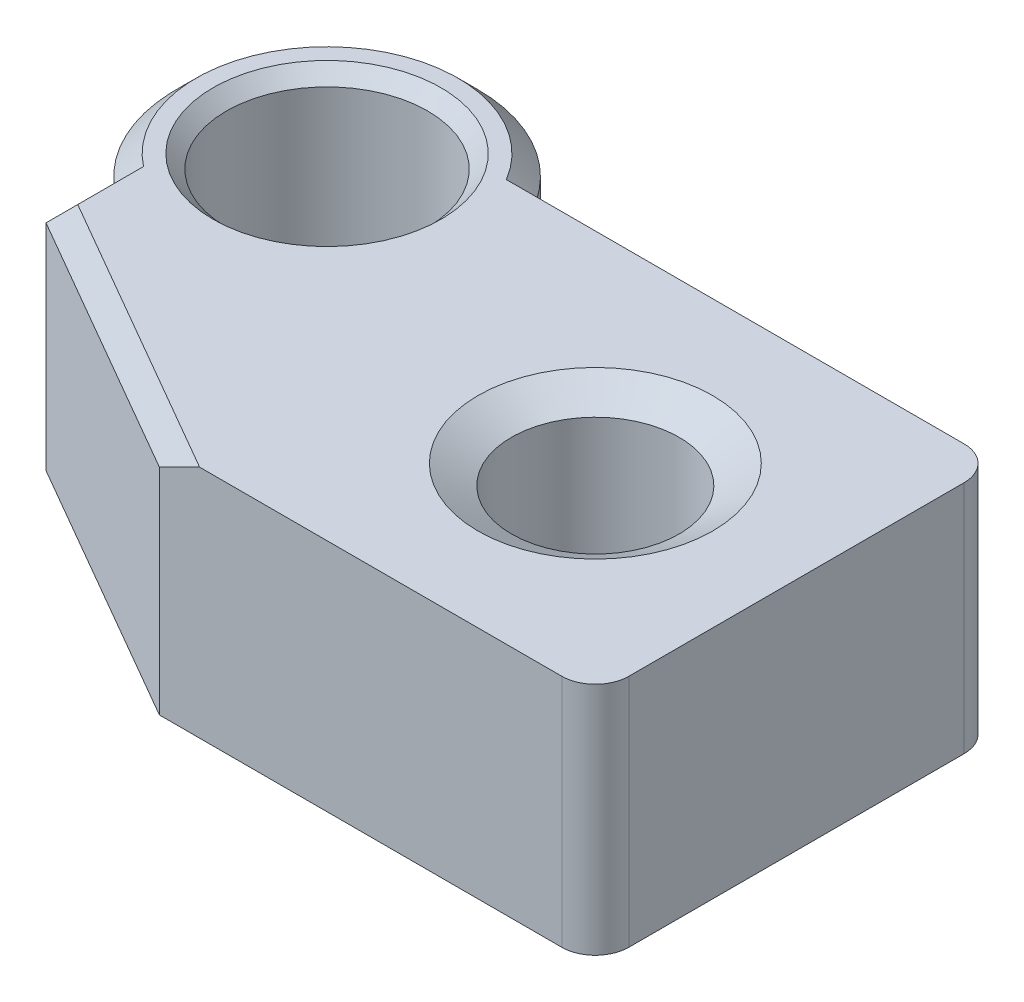
ISO-10303-21;
HEADER;
FILE_DESCRIPTION(('STEP AP214'),'2;1');
FILE_NAME('part.step','',(''),(''),'','','');
FILE_SCHEMA(('AUTOMOTIVE_DESIGN { 1 0 10303 214 1 1 1 1 }'));
ENDSEC;
DATA;
#1=APPLICATION_CONTEXT('core data for automotive mechanical design processes');
#2=APPLICATION_PROTOCOL_DEFINITION('international standard','automotive_design',2000,#1);
#3=PRODUCT_CONTEXT('',#1,'mechanical');
#4=PRODUCT('Part','Part','',(#3));
#5=PRODUCT_RELATED_PRODUCT_CATEGORY('part','',(#4));
#6=PRODUCT_DEFINITION_FORMATION('','',#4);
#7=PRODUCT_DEFINITION_CONTEXT('part definition',#1,'design');
#8=PRODUCT_DEFINITION('design','',#6,#7);
#9=PRODUCT_DEFINITION_SHAPE('','',#8);
#10=(LENGTH_UNIT() NAMED_UNIT(*) SI_UNIT(.MILLI.,.METRE.));
#11=(NAMED_UNIT(*) PLANE_ANGLE_UNIT() SI_UNIT($,.RADIAN.));
#12=(NAMED_UNIT(*) SI_UNIT($,.STERADIAN.) SOLID_ANGLE_UNIT());
#13=UNCERTAINTY_MEASURE_WITH_UNIT(LENGTH_MEASURE(1.E-05),#10,'distance_accuracy_value','');
#14=(GEOMETRIC_REPRESENTATION_CONTEXT(3) GLOBAL_UNCERTAINTY_ASSIGNED_CONTEXT((#13)) GLOBAL_UNIT_ASSIGNED_CONTEXT((#10,
#11,#12)) REPRESENTATION_CONTEXT('',''));
#15=CARTESIAN_POINT('',(0.,0.,0.));
#16=DIRECTION('',(0.,0.,1.));
#17=DIRECTION('',(1.,0.,0.));
#18=AXIS2_PLACEMENT_3D('',#15,#16,#17);
#19=CARTESIAN_POINT('',(-4.84435562925362,35.,-20.));
#20=DIRECTION('',(0.,0.,-1.));
#21=DIRECTION('',(-1.,0.,0.));
#22=AXIS2_PLACEMENT_3D('',#19,#20,#21);
#23=PLANE('',#22);
#24=DIRECTION('',(1.,0.,0.));
#25=VECTOR('',#24,1.);
#26=CARTESIAN_POINT('',(-4.84435562925362,0.,-20.));
#27=LINE('',#26,#25);
#28=CARTESIAN_POINT('',(-1.95113885676778,0.,-20.));
#29=VERTEX_POINT('',#28);
#30=CARTESIAN_POINT('',(60.,0.,-20.));
#31=VERTEX_POINT('',#30);
#32=EDGE_CURVE('E143',#29,#31,#27,.T.);
#33=ORIENTED_EDGE('',*,*,#32,.F.);
#34=DIRECTION('',(0.,-1.,0.));
#35=VECTOR('',#34,1.);
#36=CARTESIAN_POINT('',(-1.95113885676778,35.,-20.));
#37=LINE('',#36,#35);
#38=CARTESIAN_POINT('',(-1.95113885676778,29.3753109471978,-20.));
#39=VERTEX_POINT('',#38);
#40=EDGE_CURVE('E260',#29,#39,#37,.F.);
#41=ORIENTED_EDGE('',*,*,#40,.T.);
#42=CARTESIAN_POINT('',(-1.95113885676778,29.3753109471978,-20.));
#43=CARTESIAN_POINT('',(-2.43093552728547,29.8154283799261,-20.));
#44=CARTESIAN_POINT('',(-2.91178230032534,30.254405867048,-20.));
#45=CARTESIAN_POINT('',(-3.87602791843594,31.1294902840864,-20.));
#46=CARTESIAN_POINT('',(-4.35942661068586,31.5655973824585,-20.));
#47=CARTESIAN_POINT('',(-5.40863460486666,32.5054848331286,-20.));
#48=CARTESIAN_POINT('',(-5.97498570303803,33.0086617315781,-20.));
#49=CARTESIAN_POINT('',(-6.82841762979105,33.7590241480721,-20.));
#50=CARTESIAN_POINT('',(-7.11355581621878,34.0084197399272,-20.));
#51=CARTESIAN_POINT('',(-7.68530027764479,34.5055267070164,-20.));
#52=CARTESIAN_POINT('',(-7.9719065645859,34.7532380685113,-20.));
#53=CARTESIAN_POINT('',(-8.25933095721673,35.,-20.));
#54=B_SPLINE_CURVE_WITH_KNOTS('',3,(#42,#43,#44,#45,#46,#47,#48,#49,#50,#51,#52,#53),
.UNSPECIFIED.,.F.,.F.,(4,2,2,2,2,4),(0.,1.95324936939647,3.90638306677739,6.1791121462796,
7.31555583929257,8.45200879187084),.UNSPECIFIED.);
#55=CARTESIAN_POINT('',(-8.25933095721676,35.,-20.));
#56=VERTEX_POINT('',#55);
#57=EDGE_CURVE('E170',#39,#56,#54,.T.);
#58=ORIENTED_EDGE('',*,*,#57,.T.);
#59=DIRECTION('',(1.,0.,0.));
#60=VECTOR('',#59,1.);
#61=CARTESIAN_POINT('',(-4.84435562925362,35.,-20.));
#62=LINE('',#61,#60);
#63=CARTESIAN_POINT('',(60.,35.,-20.));
#64=VERTEX_POINT('',#63);
#65=EDGE_CURVE('E150',#56,#64,#62,.T.);
#66=ORIENTED_EDGE('',*,*,#65,.T.);
#67=DIRECTION('',(0.,-1.,0.));
#68=VECTOR('',#67,1.);
#69=CARTESIAN_POINT('',(60.,35.,-20.));
#70=LINE('',#69,#68);
#71=EDGE_CURVE('E263',#64,#31,#70,.T.);
#72=ORIENTED_EDGE('',*,*,#71,.T.);
#73=EDGE_LOOP('',(#33,#41,#58,#66,#72));
#74=FACE_BOUND('',#73,.T.);
#75=ADVANCED_FACE('F35',(#74),#23,.T.);
#76=CARTESIAN_POINT('',(-25.,35.,-10.));
#77=DIRECTION('',(0.,-1.,0.));
#78=DIRECTION('',(0.,0.,-1.));
#79=AXIS2_PLACEMENT_3D('',#76,#77,#78);
#80=CYLINDRICAL_SURFACE('',#79,22.5);
#81=CARTESIAN_POINT('',(-25.,32.,-10.));
#82=DIRECTION('',(0.,1.,0.));
#83=DIRECTION('',(0.,0.,1.));
#84=AXIS2_PLACEMENT_3D('',#81,#82,#83);
#85=CIRCLE('',#84,22.5);
#86=CARTESIAN_POINT('',(-40.,32.,6.77050983124841));
#87=VERTEX_POINT('',#86);
#88=CARTESIAN_POINT('',(-6.14184088281,32.,-22.2727272727273));
#89=VERTEX_POINT('',#88);
#90=EDGE_CURVE('E165',#87,#89,#85,.F.);
#91=ORIENTED_EDGE('',*,*,#90,.T.);
#92=DIRECTION('',(0.,-1.,0.));
#93=VECTOR('',#92,1.);
#94=CARTESIAN_POINT('',(-6.14184088280999,35.,-22.2727272727273));
#95=LINE('',#94,#93);
#96=CARTESIAN_POINT('',(-6.14184088281,0.,-22.2727272727273));
#97=VERTEX_POINT('',#96);
#98=EDGE_CURVE('E266',#89,#97,#95,.T.);
#99=ORIENTED_EDGE('',*,*,#98,.T.);
#100=CARTESIAN_POINT('',(-25.,0.,-10.));
#101=DIRECTION('',(0.,1.,0.));
#102=DIRECTION('',(0.,0.,1.));
#103=AXIS2_PLACEMENT_3D('',#100,#101,#102);
#104=CIRCLE('',#103,22.5);
#105=CARTESIAN_POINT('',(-40.,0.,6.77050983124841));
#106=VERTEX_POINT('',#105);
#107=EDGE_CURVE('E148',#97,#106,#104,.T.);
#108=ORIENTED_EDGE('',*,*,#107,.T.);
#109=DIRECTION('',(0.,-1.,0.));
#110=VECTOR('',#109,1.);
#111=CARTESIAN_POINT('',(-40.,35.,6.77050983124841));
#112=LINE('',#111,#110);
#113=EDGE_CURVE('E151',#87,#106,#112,.T.);
#114=ORIENTED_EDGE('',*,*,#113,.F.);
#115=EDGE_LOOP('',(#91,#99,#108,#114));
#116=FACE_BOUND('',#115,.T.);
#117=ADVANCED_FACE('F187',(#116),#80,.T.);
#118=CARTESIAN_POINT('',(-40.,35.,6.77050983124841));
#119=DIRECTION('',(1.,0.,0.));
#120=DIRECTION('',(0.,0.,-1.));
#121=AXIS2_PLACEMENT_3D('',#118,#119,#120);
#122=PLANE('',#121);
#123=DIRECTION('',(0.,-1.,0.));
#124=VECTOR('',#123,1.);
#125=CARTESIAN_POINT('',(-40.,35.,16.9059892324149));
#126=LINE('',#125,#124);
#127=CARTESIAN_POINT('',(-40.,32.,16.9059892324149));
#128=VERTEX_POINT('',#127);
#129=CARTESIAN_POINT('',(-40.,0.,16.9059892324149));
#130=VERTEX_POINT('',#129);
#131=EDGE_CURVE('E129',#128,#130,#126,.T.);
#132=ORIENTED_EDGE('',*,*,#131,.F.);
#133=DIRECTION('',(0.,0.,-1.));
#134=VECTOR('',#133,1.);
#135=CARTESIAN_POINT('',(-40.,32.,6.77050983124841));
#136=LINE('',#135,#134);
#137=EDGE_CURVE('E168',#128,#87,#136,.T.);
#138=ORIENTED_EDGE('',*,*,#137,.T.);
#139=ORIENTED_EDGE('',*,*,#113,.T.);
#140=DIRECTION('',(0.,0.,1.));
#141=VECTOR('',#140,1.);
#142=CARTESIAN_POINT('',(-40.,0.,6.77050983124841));
#143=LINE('',#142,#141);
#144=EDGE_CURVE('E138',#106,#130,#143,.T.);
#145=ORIENTED_EDGE('',*,*,#144,.T.);
#146=EDGE_LOOP('',(#132,#138,#139,#145));
#147=FACE_BOUND('',#146,.T.);
#148=ADVANCED_FACE('F311',(#147),#122,.F.);
#149=CARTESIAN_POINT('',(-40.,35.,16.9059892324149));
#150=DIRECTION('',(0.500000000000001,0.,-0.866025403784438));
#151=DIRECTION('',(-0.866025403784438,0.,-0.500000000000001));
#152=AXIS2_PLACEMENT_3D('',#149,#150,#151);
#153=PLANE('',#152);
#154=DIRECTION('',(0.,-1.,0.));
#155=VECTOR('',#154,1.);
#156=CARTESIAN_POINT('',(0.,35.,40.));
#157=LINE('',#156,#155);
#158=CARTESIAN_POINT('',(0.,32.,40.));
#159=VERTEX_POINT('',#158);
#160=CARTESIAN_POINT('',(0.,0.,40.));
#161=VERTEX_POINT('',#160);
#162=EDGE_CURVE('E122',#159,#161,#157,.T.);
#163=ORIENTED_EDGE('',*,*,#162,.F.);
#164=DIRECTION('',(-0.866025403784438,0.,-0.500000000000001));
#165=VECTOR('',#164,1.);
#166=CARTESIAN_POINT('',(-40.,32.,16.9059892324149));
#167=LINE('',#166,#165);
#168=EDGE_CURVE('E163',#159,#128,#167,.T.);
#169=ORIENTED_EDGE('',*,*,#168,.T.);
#170=ORIENTED_EDGE('',*,*,#131,.T.);
#171=DIRECTION('',(0.866025403784438,0.,0.500000000000001));
#172=VECTOR('',#171,1.);
#173=CARTESIAN_POINT('',(-40.,0.,16.9059892324149));
#174=LINE('',#173,#172);
#175=EDGE_CURVE('E133',#130,#161,#174,.T.);
#176=ORIENTED_EDGE('',*,*,#175,.T.);
#177=EDGE_LOOP('',(#163,#169,#170,#176));
#178=FACE_BOUND('',#177,.T.);
#179=ADVANCED_FACE('F134',(#178),#153,.F.);
#180=CARTESIAN_POINT('',(0.,35.,40.));
#181=DIRECTION('',(0.,0.,-1.));
#182=DIRECTION('',(-1.,0.,0.));
#183=AXIS2_PLACEMENT_3D('',#180,#181,#182);
#184=PLANE('',#183);
#185=DIRECTION('',(1.,0.,0.));
#186=VECTOR('',#185,1.);
#187=CARTESIAN_POINT('',(0.,0.,40.));
#188=LINE('',#187,#186);
#189=CARTESIAN_POINT('',(60.,0.,40.));
#190=VERTEX_POINT('',#189);
#191=EDGE_CURVE('E125',#161,#190,#188,.T.);
#192=ORIENTED_EDGE('',*,*,#191,.T.);
#193=DIRECTION('',(0.,-1.,0.));
#194=VECTOR('',#193,1.);
#195=CARTESIAN_POINT('',(60.,35.,40.));
#196=LINE('',#195,#194);
#197=CARTESIAN_POINT('',(60.,35.,40.));
#198=VERTEX_POINT('',#197);
#199=EDGE_CURVE('E55',#190,#198,#196,.F.);
#200=ORIENTED_EDGE('',*,*,#199,.T.);
#201=DIRECTION('',(1.,0.,0.));
#202=VECTOR('',#201,1.);
#203=CARTESIAN_POINT('',(0.,35.,40.));
#204=LINE('',#203,#202);
#205=CARTESIAN_POINT('',(5.99999999999992,35.,40.));
#206=VERTEX_POINT('',#205);
#207=EDGE_CURVE('E130',#206,#198,#204,.T.);
#208=ORIENTED_EDGE('',*,*,#207,.F.);
#209=DIRECTION('',(-0.894427190999913,-0.447213595499963,0.));
#210=VECTOR('',#209,1.);
#211=CARTESIAN_POINT('',(-29.9205080756886,17.0397459621555,40.));
#212=LINE('',#211,#210);
#213=EDGE_CURVE('E126',#206,#159,#212,.T.);
#214=ORIENTED_EDGE('',*,*,#213,.T.);
#215=ORIENTED_EDGE('',*,*,#162,.T.);
#216=EDGE_LOOP('',(#192,#200,#208,#214,#215));
#217=FACE_BOUND('',#216,.T.);
#218=ADVANCED_FACE('F124',(#217),#184,.F.);
#219=CARTESIAN_POINT('',(65.,35.,-20.));
#220=DIRECTION('',(1.,0.,0.));
#221=DIRECTION('',(0.,0.,-1.));
#222=AXIS2_PLACEMENT_3D('',#219,#220,#221);
#223=PLANE('',#222);
#224=DIRECTION('',(0.,0.,1.));
#225=VECTOR('',#224,1.);
#226=CARTESIAN_POINT('',(65.,35.,-20.));
#227=LINE('',#226,#225);
#228=CARTESIAN_POINT('',(65.,35.,-15.));
#229=VERTEX_POINT('',#228);
#230=CARTESIAN_POINT('',(65.,35.,35.));
#231=VERTEX_POINT('',#230);
#232=EDGE_CURVE('E324',#229,#231,#227,.T.);
#233=ORIENTED_EDGE('',*,*,#232,.T.);
#234=DIRECTION('',(0.,-1.,0.));
#235=VECTOR('',#234,1.);
#236=CARTESIAN_POINT('',(65.,0.,35.));
#237=LINE('',#236,#235);
#238=CARTESIAN_POINT('',(65.,0.,35.));
#239=VERTEX_POINT('',#238);
#240=EDGE_CURVE('E245',#231,#239,#237,.T.);
#241=ORIENTED_EDGE('',*,*,#240,.T.);
#242=DIRECTION('',(0.,0.,1.));
#243=VECTOR('',#242,1.);
#244=CARTESIAN_POINT('',(65.,0.,-20.));
#245=LINE('',#244,#243);
#246=CARTESIAN_POINT('',(65.,0.,-15.));
#247=VERTEX_POINT('',#246);
#248=EDGE_CURVE('E141',#247,#239,#245,.T.);
#249=ORIENTED_EDGE('',*,*,#248,.F.);
#250=DIRECTION('',(0.,-1.,0.));
#251=VECTOR('',#250,1.);
#252=CARTESIAN_POINT('',(65.,35.,-15.));
#253=LINE('',#252,#251);
#254=EDGE_CURVE('E258',#247,#229,#253,.F.);
#255=ORIENTED_EDGE('',*,*,#254,.T.);
#256=EDGE_LOOP('',(#233,#241,#249,#255));
#257=FACE_BOUND('',#256,.T.);
#258=ADVANCED_FACE('F189',(#257),#223,.T.);
#259=CARTESIAN_POINT('',(-25.,35.,-10.));
#260=DIRECTION('',(0.,1.,0.));
#261=DIRECTION('',(0.,0.,1.));
#262=AXIS2_PLACEMENT_3D('',#259,#260,#261);
#263=PLANE('',#262);
#264=CARTESIAN_POINT('',(35.,35.,10.));
#265=DIRECTION('',(0.,1.,0.));
#266=DIRECTION('',(0.,0.,1.));
#267=AXIS2_PLACEMENT_3D('',#264,#265,#266);
#268=CIRCLE('',#267,17.5000000000001);
#269=CARTESIAN_POINT('',(35.,35.,27.5000000000001));
#270=VERTEX_POINT('',#269);
#271=EDGE_CURVE('E269',#270,#270,#268,.F.);
#272=ORIENTED_EDGE('',*,*,#271,.T.);
#273=EDGE_LOOP('',(#272));
#274=FACE_BOUND('',#273,.T.);
#275=CARTESIAN_POINT('',(-25.,35.,-10.));
#276=DIRECTION('',(0.,1.,0.));
#277=DIRECTION('',(0.,0.,1.));
#278=AXIS2_PLACEMENT_3D('',#275,#276,#277);
#279=CIRCLE('',#278,17.0000000000001);
#280=CARTESIAN_POINT('',(-25.,35.,7.00000000000013));
#281=VERTEX_POINT('',#280);
#282=EDGE_CURVE('E281',#281,#281,#279,.F.);
#283=ORIENTED_EDGE('',*,*,#282,.T.);
#284=EDGE_LOOP('',(#283));
#285=FACE_BOUND('',#284,.T.);
#286=ORIENTED_EDGE('',*,*,#207,.T.);
#287=CARTESIAN_POINT('',(60.,35.,35.));
#288=DIRECTION('',(0.,1.,0.));
#289=DIRECTION('',(0.,0.,1.));
#290=AXIS2_PLACEMENT_3D('',#287,#288,#289);
#291=CIRCLE('',#290,5.);
#292=EDGE_CURVE('E243',#198,#231,#291,.T.);
#293=ORIENTED_EDGE('',*,*,#292,.T.);
#294=ORIENTED_EDGE('',*,*,#232,.F.);
#295=CARTESIAN_POINT('',(60.,35.,-15.));
#296=DIRECTION('',(0.,1.,0.));
#297=DIRECTION('',(0.,0.,1.));
#298=AXIS2_PLACEMENT_3D('',#295,#296,#297);
#299=CIRCLE('',#298,5.);
#300=EDGE_CURVE('E249',#229,#64,#299,.T.);
#301=ORIENTED_EDGE('',*,*,#300,.T.);
#302=ORIENTED_EDGE('',*,*,#65,.F.);
#303=CARTESIAN_POINT('',(-25.,35.,-10.));
#304=DIRECTION('',(0.,1.,0.));
#305=DIRECTION('',(0.,0.,1.));
#306=AXIS2_PLACEMENT_3D('',#303,#304,#305);
#307=CIRCLE('',#306,19.5);
#308=CARTESIAN_POINT('',(-37.,35.,5.3704261489394));
#309=VERTEX_POINT('',#308);
#310=EDGE_CURVE('E157',#56,#309,#307,.T.);
#311=ORIENTED_EDGE('',*,*,#310,.T.);
#312=DIRECTION('',(0.,0.,1.));
#313=VECTOR('',#312,1.);
#314=CARTESIAN_POINT('',(-37.,35.,16.9059892324149));
#315=LINE('',#314,#313);
#316=CARTESIAN_POINT('',(-37.,35.,15.1739384248461));
#317=VERTEX_POINT('',#316);
#318=EDGE_CURVE('E154',#309,#317,#315,.T.);
#319=ORIENTED_EDGE('',*,*,#318,.T.);
#320=DIRECTION('',(0.866025403784438,0.,0.500000000000001));
#321=VECTOR('',#320,1.);
#322=CARTESIAN_POINT('',(1.49999999999998,35.,37.4019237886467));
#323=LINE('',#322,#321);
#324=EDGE_CURVE('E159',#317,#206,#323,.T.);
#325=ORIENTED_EDGE('',*,*,#324,.T.);
#326=EDGE_LOOP('',(#286,#293,#294,#301,#302,#311,#319,#325));
#327=FACE_BOUND('',#326,.T.);
#328=ADVANCED_FACE('F296',(#274,#285,#327),#263,.T.);
#329=CARTESIAN_POINT('',(-25.,0.,-10.));
#330=DIRECTION('',(0.,1.,0.));
#331=DIRECTION('',(0.,0.,1.));
#332=AXIS2_PLACEMENT_3D('',#329,#330,#331);
#333=PLANE('',#332);
#334=CARTESIAN_POINT('',(35.,0.,10.));
#335=DIRECTION('',(0.,1.,0.));
#336=DIRECTION('',(0.,0.,1.));
#337=AXIS2_PLACEMENT_3D('',#334,#335,#336);
#338=CIRCLE('',#337,15.3867513459481);
#339=CARTESIAN_POINT('',(35.,0.,25.386751345948));
#340=VERTEX_POINT('',#339);
#341=EDGE_CURVE('E278',#340,#340,#338,.T.);
#342=ORIENTED_EDGE('',*,*,#341,.T.);
#343=EDGE_LOOP('',(#342));
#344=FACE_BOUND('',#343,.T.);
#345=CARTESIAN_POINT('',(-25.,0.,-10.));
#346=DIRECTION('',(0.,1.,0.));
#347=DIRECTION('',(0.,0.,1.));
#348=AXIS2_PLACEMENT_3D('',#345,#346,#347);
#349=CIRCLE('',#348,17.);
#350=CARTESIAN_POINT('',(-25.,0.,6.99999999999998));
#351=VERTEX_POINT('',#350);
#352=EDGE_CURVE('E177',#351,#351,#349,.T.);
#353=ORIENTED_EDGE('',*,*,#352,.T.);
#354=EDGE_LOOP('',(#353));
#355=FACE_BOUND('',#354,.T.);
#356=ORIENTED_EDGE('',*,*,#248,.T.);
#357=CARTESIAN_POINT('',(60.,0.,35.));
#358=DIRECTION('',(0.,1.,0.));
#359=DIRECTION('',(0.,0.,1.));
#360=AXIS2_PLACEMENT_3D('',#357,#358,#359);
#361=CIRCLE('',#360,5.);
#362=EDGE_CURVE('E63',#239,#190,#361,.F.);
#363=ORIENTED_EDGE('',*,*,#362,.T.);
#364=ORIENTED_EDGE('',*,*,#191,.F.);
#365=ORIENTED_EDGE('',*,*,#175,.F.);
#366=ORIENTED_EDGE('',*,*,#144,.F.);
#367=ORIENTED_EDGE('',*,*,#107,.F.);
#368=CARTESIAN_POINT('',(-1.95113885676778,0.,-25.));
#369=DIRECTION('',(0.,1.,0.));
#370=DIRECTION('',(0.,0.,1.));
#371=AXIS2_PLACEMENT_3D('',#368,#369,#370);
#372=CIRCLE('',#371,5.);
#373=EDGE_CURVE('E48',#97,#29,#372,.T.);
#374=ORIENTED_EDGE('',*,*,#373,.T.);
#375=ORIENTED_EDGE('',*,*,#32,.T.);
#376=CARTESIAN_POINT('',(60.,0.,-15.));
#377=DIRECTION('',(0.,1.,0.));
#378=DIRECTION('',(0.,0.,1.));
#379=AXIS2_PLACEMENT_3D('',#376,#377,#378);
#380=CIRCLE('',#379,5.);
#381=EDGE_CURVE('E255',#31,#247,#380,.F.);
#382=ORIENTED_EDGE('',*,*,#381,.T.);
#383=EDGE_LOOP('',(#356,#363,#364,#365,#366,#367,#374,#375,#382));
#384=FACE_BOUND('',#383,.T.);
#385=ADVANCED_FACE('F140',(#344,#355,#384),#333,.F.);
#386=CARTESIAN_POINT('',(-25.,-1.2E-05,-10.));
#387=DIRECTION('',(0.,1.,0.));
#388=DIRECTION('',(0.,0.,1.));
#389=AXIS2_PLACEMENT_3D('',#386,#387,#388);
#390=CYLINDRICAL_SURFACE('',#389,15.);
#391=CARTESIAN_POINT('',(-25.,1.99999999999999,-10.));
#392=DIRECTION('',(0.,1.,0.));
#393=DIRECTION('',(0.,0.,1.));
#394=AXIS2_PLACEMENT_3D('',#391,#392,#393);
#395=CIRCLE('',#394,15.);
#396=CARTESIAN_POINT('',(-25.,1.99999999999999,5.));
#397=VERTEX_POINT('',#396);
#398=EDGE_CURVE('E284',#397,#397,#395,.F.);
#399=CARTESIAN_POINT('',(-25.,32.9999999999999,-10.));
#400=DIRECTION('',(0.,1.,0.));
#401=DIRECTION('',(0.,0.,1.));
#402=AXIS2_PLACEMENT_3D('',#399,#400,#401);
#403=CIRCLE('',#402,15.);
#404=CARTESIAN_POINT('',(-25.,32.9999999999999,5.));
#405=VERTEX_POINT('',#404);
#406=EDGE_CURVE('E286',#405,#405,#403,.T.);
#407=CARTESIAN_POINT('',(-25.,1.99999999999999,5.));
#408=CARTESIAN_POINT('',(-25.,2.32291666666665,5.));
#409=CARTESIAN_POINT('',(-25.,2.64583333333332,5.));
#410=CARTESIAN_POINT('',(-25.,3.29166666666665,5.));
#411=CARTESIAN_POINT('',(-25.,3.61458333333332,5.));
#412=CARTESIAN_POINT('',(-25.,4.26041666666665,5.));
#413=CARTESIAN_POINT('',(-25.,4.58333333333331,5.));
#414=CARTESIAN_POINT('',(-25.,5.22916666666664,5.));
#415=CARTESIAN_POINT('',(-25.,5.55208333333331,5.));
#416=CARTESIAN_POINT('',(-25.,6.19791666666664,5.));
#417=CARTESIAN_POINT('',(-25.,6.52083333333331,5.));
#418=CARTESIAN_POINT('',(-25.,7.16666666666664,5.));
#419=CARTESIAN_POINT('',(-25.,7.4895833333333,5.));
#420=CARTESIAN_POINT('',(-25.,8.13541666666663,5.));
#421=CARTESIAN_POINT('',(-25.,8.4583333333333,5.));
#422=CARTESIAN_POINT('',(-25.,9.10416666666663,5.));
#423=CARTESIAN_POINT('',(-25.,9.42708333333329,5.));
#424=CARTESIAN_POINT('',(-25.,10.0729166666666,5.));
#425=CARTESIAN_POINT('',(-25.,10.3958333333333,5.));
#426=CARTESIAN_POINT('',(-25.,11.0416666666666,5.));
#427=CARTESIAN_POINT('',(-25.,11.3645833333333,5.));
#428=CARTESIAN_POINT('',(-25.,12.0104166666666,5.));
#429=CARTESIAN_POINT('',(-25.,12.3333333333333,5.));
#430=CARTESIAN_POINT('',(-25.,12.9791666666666,5.));
#431=CARTESIAN_POINT('',(-25.,13.3020833333333,5.));
#432=CARTESIAN_POINT('',(-25.,13.9479166666666,5.));
#433=CARTESIAN_POINT('',(-25.,14.2708333333333,5.));
#434=CARTESIAN_POINT('',(-25.,14.9166666666666,5.));
#435=CARTESIAN_POINT('',(-25.,15.2395833333333,5.));
#436=CARTESIAN_POINT('',(-25.,15.8854166666666,5.));
#437=CARTESIAN_POINT('',(-25.,16.2083333333333,5.));
#438=CARTESIAN_POINT('',(-25.,16.8541666666666,5.));
#439=CARTESIAN_POINT('',(-25.,17.1770833333333,5.));
#440=CARTESIAN_POINT('',(-25.,17.8229166666666,5.));
#441=CARTESIAN_POINT('',(-25.,18.1458333333333,5.));
#442=CARTESIAN_POINT('',(-25.,18.7916666666666,5.));
#443=CARTESIAN_POINT('',(-25.,19.1145833333333,5.));
#444=CARTESIAN_POINT('',(-25.,19.7604166666666,5.));
#445=CARTESIAN_POINT('',(-25.,20.0833333333333,5.));
#446=CARTESIAN_POINT('',(-25.,20.7291666666666,5.));
#447=CARTESIAN_POINT('',(-25.,21.0520833333333,5.));
#448=CARTESIAN_POINT('',(-25.,21.6979166666666,5.));
#449=CARTESIAN_POINT('',(-25.,22.0208333333333,5.));
#450=CARTESIAN_POINT('',(-25.,22.6666666666666,5.));
#451=CARTESIAN_POINT('',(-25.,22.9895833333332,5.));
#452=CARTESIAN_POINT('',(-25.,23.6354166666666,5.));
#453=CARTESIAN_POINT('',(-25.,23.9583333333332,5.));
#454=CARTESIAN_POINT('',(-25.,24.6041666666666,5.));
#455=CARTESIAN_POINT('',(-25.,24.9270833333332,5.));
#456=CARTESIAN_POINT('',(-25.,25.5729166666666,5.));
#457=CARTESIAN_POINT('',(-25.,25.8958333333332,5.));
#458=CARTESIAN_POINT('',(-25.,26.5416666666666,5.));
#459=CARTESIAN_POINT('',(-25.,26.8645833333332,5.));
#460=CARTESIAN_POINT('',(-25.,27.5104166666666,5.));
#461=CARTESIAN_POINT('',(-25.,27.8333333333332,5.));
#462=CARTESIAN_POINT('',(-25.,28.4791666666666,5.));
#463=CARTESIAN_POINT('',(-25.,28.8020833333332,5.));
#464=CARTESIAN_POINT('',(-25.,29.4479166666666,5.));
#465=CARTESIAN_POINT('',(-25.,29.7708333333332,5.));
#466=CARTESIAN_POINT('',(-25.,30.4166666666666,5.));
#467=CARTESIAN_POINT('',(-25.,30.7395833333332,5.));
#468=CARTESIAN_POINT('',(-25.,31.3854166666665,5.));
#469=CARTESIAN_POINT('',(-25.,31.7083333333332,5.));
#470=CARTESIAN_POINT('',(-25.,32.3541666666665,5.));
#471=CARTESIAN_POINT('',(-25.,32.6770833333332,5.));
#472=CARTESIAN_POINT('',(-25.,32.9999999999999,5.));
#473=B_SPLINE_CURVE_WITH_KNOTS('',3,(#407,#408,#409,#410,#411,#412,#413,#414,#415,#416,#417,
#418,#419,#420,#421,#422,#423,#424,#425,#426,#427,#428,#429,#430,#431,#432,#433,#434,#435,#436,
#437,#438,#439,#440,#441,#442,#443,#444,#445,#446,#447,#448,#449,#450,#451,#452,#453,#454,#455,
#456,#457,#458,#459,#460,#461,#462,#463,#464,#465,#466,#467,#468,#469,#470,#471,#472),
.UNSPECIFIED.,.F.,.F.,(4,2,2,2,2,2,2,2,2,2,2,2,2,2,2,2,2,2,2,2,2,2,2,2,2,2,2,2,2,2,2,2,4),(0.,
0.968749999999997,1.93749999999999,2.90624999999999,3.87499999999999,4.84374999999998,
5.81249999999998,6.78124999999998,7.74999999999997,8.71874999999997,9.68749999999996,10.65625,
11.625,12.59375,13.5625,14.5312499999999,15.4999999999999,16.4687499999999,17.4374999999999,
18.4062499999999,19.3749999999999,20.3437499999999,21.3124999999999,22.2812499999999,
23.2499999999999,24.2187499999999,25.1874999999999,26.1562499999999,27.1249999999999,
28.0937499999999,29.0624999999999,30.0312499999999,30.9999999999999),.UNSPECIFIED.);
#474=EDGE_CURVE('BSEAM295',#397,#405,#473,.T.);
#475=ORIENTED_EDGE('',*,*,#398,.T.);
#476=ORIENTED_EDGE('',*,*,#406,.T.);
#477=ORIENTED_EDGE('',*,*,#474,.T.);
#478=ORIENTED_EDGE('',*,*,#474,.F.);
#479=EDGE_LOOP('',(#475,#477,#476,#478));
#480=FACE_BOUND('',#479,.T.);
#481=ADVANCED_FACE('F295',(#480),#390,.F.);
#482=CARTESIAN_POINT('',(35.,-1.2E-05,10.));
#483=DIRECTION('',(0.,1.,0.));
#484=DIRECTION('',(0.,0.,1.));
#485=AXIS2_PLACEMENT_3D('',#482,#483,#484);
#486=CYLINDRICAL_SURFACE('',#485,12.5);
#487=CARTESIAN_POINT('',(35.,4.99999999999989,10.));
#488=DIRECTION('',(0.,1.,0.));
#489=DIRECTION('',(0.,0.,1.));
#490=AXIS2_PLACEMENT_3D('',#487,#488,#489);
#491=CIRCLE('',#490,12.5);
#492=CARTESIAN_POINT('',(35.,4.99999999999989,22.5));
#493=VERTEX_POINT('',#492);
#494=EDGE_CURVE('E272',#493,#493,#491,.F.);
#495=CARTESIAN_POINT('',(35.,32.1132486540518,10.));
#496=DIRECTION('',(0.,1.,0.));
#497=DIRECTION('',(0.,0.,1.));
#498=AXIS2_PLACEMENT_3D('',#495,#496,#497);
#499=CIRCLE('',#498,12.5);
#500=CARTESIAN_POINT('',(35.,32.1132486540518,22.5));
#501=VERTEX_POINT('',#500);
#502=EDGE_CURVE('E275',#501,#501,#499,.T.);
#503=CARTESIAN_POINT('',(35.,4.99999999999989,22.5));
#504=CARTESIAN_POINT('',(35.,5.28242967347959,22.5));
#505=CARTESIAN_POINT('',(35.,5.5648593469593,22.5));
#506=CARTESIAN_POINT('',(35.,6.12971869391872,22.5));
#507=CARTESIAN_POINT('',(35.,6.41214836739843,22.5));
#508=CARTESIAN_POINT('',(35.,6.97700771435784,22.5));
#509=CARTESIAN_POINT('',(35.,7.25943738783755,22.5));
#510=CARTESIAN_POINT('',(35.,7.82429673479696,22.5));
#511=CARTESIAN_POINT('',(35.,8.10672640827667,22.5));
#512=CARTESIAN_POINT('',(35.,8.67158575523609,22.5));
#513=CARTESIAN_POINT('',(35.,8.95401542871579,22.5));
#514=CARTESIAN_POINT('',(35.,9.51887477567521,22.5));
#515=CARTESIAN_POINT('',(35.,9.80130444915492,22.5));
#516=CARTESIAN_POINT('',(35.,10.3661637961143,22.5));
#517=CARTESIAN_POINT('',(35.,10.648593469594,22.5));
#518=CARTESIAN_POINT('',(35.,11.2134528165535,22.5));
#519=CARTESIAN_POINT('',(35.,11.4958824900332,22.5));
#520=CARTESIAN_POINT('',(35.,12.0607418369926,22.5));
#521=CARTESIAN_POINT('',(35.,12.3431715104723,22.5));
#522=CARTESIAN_POINT('',(35.,12.9080308574317,22.5));
#523=CARTESIAN_POINT('',(35.,13.1904605309114,22.5));
#524=CARTESIAN_POINT('',(35.,13.7553198778708,22.5));
#525=CARTESIAN_POINT('',(35.,14.0377495513505,22.5));
#526=CARTESIAN_POINT('',(35.,14.6026088983099,22.5));
#527=CARTESIAN_POINT('',(35.,14.8850385717897,22.5));
#528=CARTESIAN_POINT('',(35.,15.4498979187491,22.5));
#529=CARTESIAN_POINT('',(35.,15.7323275922288,22.5));
#530=CARTESIAN_POINT('',(35.,16.2971869391882,22.5));
#531=CARTESIAN_POINT('',(35.,16.5796166126679,22.5));
#532=CARTESIAN_POINT('',(35.,17.1444759596273,22.5));
#533=CARTESIAN_POINT('',(35.,17.426905633107,22.5));
#534=CARTESIAN_POINT('',(35.,17.9917649800664,22.5));
#535=CARTESIAN_POINT('',(35.,18.2741946535461,22.5));
#536=CARTESIAN_POINT('',(35.,18.8390540005056,22.5));
#537=CARTESIAN_POINT('',(35.,19.1214836739853,22.5));
#538=CARTESIAN_POINT('',(35.,19.6863430209447,22.5));
#539=CARTESIAN_POINT('',(35.,19.9687726944244,22.5));
#540=CARTESIAN_POINT('',(35.,20.5336320413838,22.5));
#541=CARTESIAN_POINT('',(35.,20.8160617148635,22.5));
#542=CARTESIAN_POINT('',(35.,21.3809210618229,22.5));
#543=CARTESIAN_POINT('',(35.,21.6633507353026,22.5));
#544=CARTESIAN_POINT('',(35.,22.2282100822621,22.5));
#545=CARTESIAN_POINT('',(35.,22.5106397557418,22.5));
#546=CARTESIAN_POINT('',(35.,23.0754991027012,22.5));
#547=CARTESIAN_POINT('',(35.,23.3579287761809,22.5));
#548=CARTESIAN_POINT('',(35.,23.9227881231403,22.5));
#549=CARTESIAN_POINT('',(35.,24.20521779662,22.5));
#550=CARTESIAN_POINT('',(35.,24.7700771435794,22.5));
#551=CARTESIAN_POINT('',(35.,25.0525068170591,22.5));
#552=CARTESIAN_POINT('',(35.,25.6173661640185,22.5));
#553=CARTESIAN_POINT('',(35.,25.8997958374983,22.5));
#554=CARTESIAN_POINT('',(35.,26.4646551844577,22.5));
#555=CARTESIAN_POINT('',(35.,26.7470848579374,22.5));
#556=CARTESIAN_POINT('',(35.,27.3119442048968,22.5));
#557=CARTESIAN_POINT('',(35.,27.5943738783765,22.5));
#558=CARTESIAN_POINT('',(35.,28.1592332253359,22.5));
#559=CARTESIAN_POINT('',(35.,28.4416628988156,22.5));
#560=CARTESIAN_POINT('',(35.,29.006522245775,22.5));
#561=CARTESIAN_POINT('',(35.,29.2889519192547,22.5));
#562=CARTESIAN_POINT('',(35.,29.8538112662142,22.5));
#563=CARTESIAN_POINT('',(35.,30.1362409396939,22.5));
#564=CARTESIAN_POINT('',(35.,30.7011002866533,22.5));
#565=CARTESIAN_POINT('',(35.,30.983529960133,22.5));
#566=CARTESIAN_POINT('',(35.,31.5483893070924,22.5));
#567=CARTESIAN_POINT('',(35.,31.8308189805721,22.5));
#568=CARTESIAN_POINT('',(35.,32.1132486540518,22.5));
#569=B_SPLINE_CURVE_WITH_KNOTS('',3,(#503,#504,#505,#506,#507,#508,#509,#510,#511,#512,#513,
#514,#515,#516,#517,#518,#519,#520,#521,#522,#523,#524,#525,#526,#527,#528,#529,#530,#531,#532,
#533,#534,#535,#536,#537,#538,#539,#540,#541,#542,#543,#544,#545,#546,#547,#548,#549,#550,#551,
#552,#553,#554,#555,#556,#557,#558,#559,#560,#561,#562,#563,#564,#565,#566,#567,#568),
.UNSPECIFIED.,.F.,.F.,(4,2,2,2,2,2,2,2,2,2,2,2,2,2,2,2,2,2,2,2,2,2,2,2,2,2,2,2,2,2,2,2,4),(0.,
0.847289020439124,1.69457804087825,2.54186706131737,3.38915608175649,4.23644510219562,
5.08373412263474,5.93102314307386,6.77831216351298,7.62560118395211,8.47289020439123,
9.32017922483035,10.1674682452695,11.0147572657086,11.8620462861477,12.7093353065868,
13.556624327026,14.4039133474651,15.2512023679042,16.0984913883433,16.9457804087825,
17.7930694292216,18.6403584496607,19.4876474700998,20.334936490539,21.1822255109781,
22.0295145314172,22.8768035518563,23.7240925722954,24.5713815927346,25.4186706131737,
26.2659596336128,27.1132486540519),.UNSPECIFIED.);
#570=EDGE_CURVE('BSEAM303',#493,#501,#569,.T.);
#571=ORIENTED_EDGE('',*,*,#494,.T.);
#572=ORIENTED_EDGE('',*,*,#502,.T.);
#573=ORIENTED_EDGE('',*,*,#570,.T.);
#574=ORIENTED_EDGE('',*,*,#570,.F.);
#575=EDGE_LOOP('',(#571,#573,#572,#574));
#576=FACE_BOUND('',#575,.T.);
#577=ADVANCED_FACE('F303',(#576),#486,.F.);
#578=CARTESIAN_POINT('',(-25.,35.,-10.));
#579=DIRECTION('',(0.,-1.,0.));
#580=DIRECTION('',(0.,0.,-1.));
#581=AXIS2_PLACEMENT_3D('',#578,#579,#580);
#582=CONICAL_SURFACE('',#581,19.5,0.785398163397444);
#583=ORIENTED_EDGE('',*,*,#57,.F.);
#584=CARTESIAN_POINT('',(-1.95113885676778,29.3753109471978,-20.));
#585=CARTESIAN_POINT('',(-2.02856914047657,29.4463417982122,-20.0000026458152));
#586=CARTESIAN_POINT('',(-2.10637714007067,29.5169508832972,-20.0017985148575));
#587=CARTESIAN_POINT('',(-2.26271661312481,29.6571944238616,-20.0091032882244));
#588=CARTESIAN_POINT('',(-2.34124820680167,29.7268287123656,-20.0146128209167));
#589=CARTESIAN_POINT('',(-2.57831432013626,29.9344513968467,-20.0369455802122));
#590=CARTESIAN_POINT('',(-2.73785475264063,30.0707314058862,-20.0595745381382));
#591=CARTESIAN_POINT('',(-3.06134169942853,30.3390790876223,-20.1219884418685));
#592=CARTESIAN_POINT('',(-3.22531838679538,30.4710524520524,-20.1620265486197));
#593=CARTESIAN_POINT('',(-3.5541766389435,30.7261731575523,-20.2608329281881));
#594=CARTESIAN_POINT('',(-3.7190565202724,30.8493331812781,-20.3195735954763));
#595=CARTESIAN_POINT('',(-4.06797834955106,31.0978618172057,-20.465812898693));
#596=CARTESIAN_POINT('',(-4.25199820533077,31.2217932997809,-20.5558775134851));
#597=CARTESIAN_POINT('',(-4.61592927682308,31.4490584607208,-20.7641268941864));
#598=CARTESIAN_POINT('',(-4.79585432544123,31.5524751170461,-20.8821939538559));
#599=CARTESIAN_POINT('',(-5.11826686249883,31.717181823075,-21.1266170962374));
#600=CARTESIAN_POINT('',(-5.26203847394887,31.7826052706424,-21.2484027294502));
#601=CARTESIAN_POINT('',(-5.46975177603301,31.8628464641559,-21.4463350469905));
#602=CARTESIAN_POINT('',(-5.53764223626915,31.8866057980579,-21.5148270709286));
#603=CARTESIAN_POINT('',(-5.67020947691467,31.9276820496481,-21.6566600202095));
#604=CARTESIAN_POINT('',(-5.73488766084122,31.945001802778,-21.7299987946636));
#605=CARTESIAN_POINT('',(-5.85904077818658,31.9724657837793,-21.8794993277557));
#606=CARTESIAN_POINT('',(-5.91859807527001,31.9827573222932,-21.9555655197891));
#607=CARTESIAN_POINT('',(-6.03351786653952,31.9965415555456,-22.1114668766857));
#608=CARTESIAN_POINT('',(-6.08887757421342,32.000029771319,-22.1913044890678));
#609=CARTESIAN_POINT('',(-6.14184088281,32.,-22.2727272727273));
#610=B_SPLINE_CURVE_WITH_KNOTS('',3,(#584,#585,#586,#587,#588,#589,#590,#591,#592,#593,#594,
#595,#596,#597,#598,#599,#600,#601,#602,#603,#604,#605,#606,#607,#608,#609),.UNSPECIFIED.,.F.,
.F.,(4,2,2,2,2,2,2,2,2,2,2,2,4),(0.,0.315192690870201,0.630438727070693,1.26282320826459,
1.90472848622219,2.54569065157495,3.26187616170043,3.97510298720475,4.57082281557072,
4.86846594243881,5.16597785702999,5.45704499563428,5.7483036935864),.UNSPECIFIED.);
#611=EDGE_CURVE('E11',#39,#89,#610,.T.);
#612=ORIENTED_EDGE('',*,*,#611,.T.);
#613=ORIENTED_EDGE('',*,*,#90,.F.);
#614=CARTESIAN_POINT('',(-37.,35.,5.3704261489394));
#615=CARTESIAN_POINT('',(-37.248878307621,34.7511216923791,5.49186353864849));
#616=CARTESIAN_POINT('',(-37.49806840787,34.5019315921301,5.61201947400098));
#617=CARTESIAN_POINT('',(-37.9970160671733,34.0029839328268,5.84990250103496));
#618=CARTESIAN_POINT('',(-38.2467736019512,33.7532263980488,5.96762969453031));
#619=CARTESIAN_POINT('',(-38.74681911092,33.25318088908,6.20079863801647));
#620=CARTESIAN_POINT('',(-38.9971070812592,33.0028929187409,6.3162404045402));
#621=CARTESIAN_POINT('',(-39.4981874270315,32.5018125729685,6.54496522390026));
#622=CARTESIAN_POINT('',(-39.7489798232079,32.2510201767921,6.65824818586863));
#623=CARTESIAN_POINT('',(-40.,32.,6.77050983124842));
#624=B_SPLINE_CURVE_WITH_KNOTS('',3,(#614,#615,#616,#617,#618,#619,#620,#621,#622,#623),
.UNSPECIFIED.,.F.,.F.,(4,2,2,2,4),(0.,1.11697879697922,2.23391067420873,3.35083446852478,
4.46780517279005),.UNSPECIFIED.);
#625=EDGE_CURVE('E209',#309,#87,#624,.T.);
#626=ORIENTED_EDGE('',*,*,#625,.F.);
#627=ORIENTED_EDGE('',*,*,#310,.F.);
#628=EDGE_LOOP('',(#583,#612,#613,#626,#627));
#629=FACE_BOUND('',#628,.T.);
#630=ADVANCED_FACE('F180',(#629),#582,.T.);
#631=CARTESIAN_POINT('',(-37.,35.,-9.99999999999999));
#632=DIRECTION('',(-0.707106781186552,0.707106781186543,0.));
#633=DIRECTION('',(0.,0.,-1.));
#634=AXIS2_PLACEMENT_3D('',#631,#632,#633);
#635=PLANE('',#634);
#636=ORIENTED_EDGE('',*,*,#625,.T.);
#637=ORIENTED_EDGE('',*,*,#137,.F.);
#638=DIRECTION('',(0.654653670707973,0.654653670707982,-0.377964473009225));
#639=VECTOR('',#638,1.);
#640=CARTESIAN_POINT('',(-30.7710656602224,41.2289343397777,11.5776615070109));
#641=LINE('',#640,#639);
#642=EDGE_CURVE('E178',#317,#128,#641,.F.);
#643=ORIENTED_EDGE('',*,*,#642,.F.);
#644=ORIENTED_EDGE('',*,*,#318,.F.);
#645=EDGE_LOOP('',(#636,#637,#643,#644));
#646=FACE_BOUND('',#645,.T.);
#647=ADVANCED_FACE('F194',(#646),#635,.T.);
#648=CARTESIAN_POINT('',(-38.900635094611,35.,14.0766062413412));
#649=DIRECTION('',(-0.353553390593277,0.707106781186543,0.612372435695798));
#650=DIRECTION('',(-0.866025403784438,0.,-0.500000000000001));
#651=AXIS2_PLACEMENT_3D('',#648,#649,#650);
#652=PLANE('',#651);
#653=ORIENTED_EDGE('',*,*,#642,.T.);
#654=ORIENTED_EDGE('',*,*,#168,.F.);
#655=ORIENTED_EDGE('',*,*,#213,.F.);
#656=ORIENTED_EDGE('',*,*,#324,.F.);
#657=EDGE_LOOP('',(#653,#654,#655,#656));
#658=FACE_BOUND('',#657,.T.);
#659=ADVANCED_FACE('F191',(#658),#652,.T.);
#660=CARTESIAN_POINT('',(-25.,0.,-10.));
#661=DIRECTION('',(0.,-1.,0.));
#662=DIRECTION('',(0.,0.,-1.));
#663=AXIS2_PLACEMENT_3D('',#660,#661,#662);
#664=CONICAL_SURFACE('',#663,17.,0.785398163397447);
#665=ORIENTED_EDGE('',*,*,#398,.F.);
#666=EDGE_LOOP('',(#665));
#667=FACE_BOUND('',#666,.T.);
#668=ORIENTED_EDGE('',*,*,#352,.F.);
#669=EDGE_LOOP('',(#668));
#670=FACE_BOUND('',#669,.T.);
#671=ADVANCED_FACE('F193',(#667,#670),#664,.F.);
#672=CARTESIAN_POINT('',(-25.,32.9999999999999,-10.));
#673=DIRECTION('',(0.,1.,0.));
#674=DIRECTION('',(0.,0.,1.));
#675=AXIS2_PLACEMENT_3D('',#672,#673,#674);
#676=CONICAL_SURFACE('',#675,15.,0.78539816339745);
#677=ORIENTED_EDGE('',*,*,#282,.F.);
#678=EDGE_LOOP('',(#677));
#679=FACE_BOUND('',#678,.T.);
#680=ORIENTED_EDGE('',*,*,#406,.F.);
#681=EDGE_LOOP('',(#680));
#682=FACE_BOUND('',#681,.T.);
#683=ADVANCED_FACE('F200',(#679,#682),#676,.F.);
#684=CARTESIAN_POINT('',(35.,0.,10.));
#685=DIRECTION('',(0.,-1.,0.));
#686=DIRECTION('',(0.,0.,-1.));
#687=AXIS2_PLACEMENT_3D('',#684,#685,#686);
#688=CONICAL_SURFACE('',#687,15.3867513459481,0.523598775598296);
#689=ORIENTED_EDGE('',*,*,#494,.F.);
#690=EDGE_LOOP('',(#689));
#691=FACE_BOUND('',#690,.T.);
#692=ORIENTED_EDGE('',*,*,#341,.F.);
#693=EDGE_LOOP('',(#692));
#694=FACE_BOUND('',#693,.T.);
#695=ADVANCED_FACE('F222',(#691,#694),#688,.F.);
#696=CARTESIAN_POINT('',(35.,32.1132486540518,10.));
#697=DIRECTION('',(0.,1.,0.));
#698=DIRECTION('',(0.,0.,1.));
#699=AXIS2_PLACEMENT_3D('',#696,#697,#698);
#700=CONICAL_SURFACE('',#699,12.5,1.0471975511966);
#701=CARTESIAN_POINT('',(35.,35.,27.5000000000001));
#702=CARTESIAN_POINT('',(35.,34.9699296734797,27.4479166666668));
#703=CARTESIAN_POINT('',(35.,34.9398593469594,27.3958333333335));
#704=CARTESIAN_POINT('',(35.,34.8797186939188,27.2916666666668));
#705=CARTESIAN_POINT('',(35.,34.8496483673985,27.2395833333334));
#706=CARTESIAN_POINT('',(35.,34.7895077143579,27.1354166666668));
#707=CARTESIAN_POINT('',(35.,34.7594373878377,27.0833333333334));
#708=CARTESIAN_POINT('',(35.,34.6992967347971,26.9791666666668));
#709=CARTESIAN_POINT('',(35.,34.6692264082768,26.9270833333334));
#710=CARTESIAN_POINT('',(35.,34.6090857552362,26.8229166666668));
#711=CARTESIAN_POINT('',(35.,34.5790154287159,26.7708333333334));
#712=CARTESIAN_POINT('',(35.,34.5188747756753,26.6666666666668));
#713=CARTESIAN_POINT('',(35.,34.488804449155,26.6145833333334));
#714=CARTESIAN_POINT('',(35.,34.4286637961144,26.5104166666668));
#715=CARTESIAN_POINT('',(35.,34.3985934695941,26.4583333333334));
#716=CARTESIAN_POINT('',(35.,34.3384528165535,26.3541666666668));
#717=CARTESIAN_POINT('',(35.,34.3083824900332,26.3020833333334));
#718=CARTESIAN_POINT('',(35.,34.2482418369927,26.1979166666667));
#719=CARTESIAN_POINT('',(35.,34.2181715104724,26.1458333333334));
#720=CARTESIAN_POINT('',(35.,34.1580308574318,26.0416666666667));
#721=CARTESIAN_POINT('',(35.,34.1279605309115,25.9895833333334));
#722=CARTESIAN_POINT('',(35.,34.0678198778709,25.8854166666667));
#723=CARTESIAN_POINT('',(35.,34.0377495513506,25.8333333333334));
#724=CARTESIAN_POINT('',(35.,33.97760889831,25.7291666666667));
#725=CARTESIAN_POINT('',(35.,33.9475385717897,25.6770833333334));
#726=CARTESIAN_POINT('',(35.,33.8873979187491,25.5729166666667));
#727=CARTESIAN_POINT('',(35.,33.8573275922288,25.5208333333334));
#728=CARTESIAN_POINT('',(35.,33.7971869391883,25.4166666666667));
#729=CARTESIAN_POINT('',(35.,33.767116612668,25.3645833333334));
#730=CARTESIAN_POINT('',(35.,33.7069759596274,25.2604166666667));
#731=CARTESIAN_POINT('',(35.,33.6769056331071,25.2083333333334));
#732=CARTESIAN_POINT('',(35.,33.6167649800665,25.1041666666667));
#733=CARTESIAN_POINT('',(35.,33.5866946535462,25.0520833333334));
#734=CARTESIAN_POINT('',(35.,33.5265540005056,24.9479166666667));
#735=CARTESIAN_POINT('',(35.,33.4964836739853,24.8958333333334));
#736=CARTESIAN_POINT('',(35.,33.4363430209447,24.7916666666667));
#737=CARTESIAN_POINT('',(35.,33.4062726944244,24.7395833333334));
#738=CARTESIAN_POINT('',(35.,33.3461320413839,24.6354166666667));
#739=CARTESIAN_POINT('',(35.,33.3160617148636,24.5833333333334));
#740=CARTESIAN_POINT('',(35.,33.255921061823,24.4791666666667));
#741=CARTESIAN_POINT('',(35.,33.2258507353027,24.4270833333334));
#742=CARTESIAN_POINT('',(35.,33.1657100822621,24.3229166666667));
#743=CARTESIAN_POINT('',(35.,33.1356397557418,24.2708333333334));
#744=CARTESIAN_POINT('',(35.,33.0754991027012,24.1666666666667));
#745=CARTESIAN_POINT('',(35.,33.0454287761809,24.1145833333334));
#746=CARTESIAN_POINT('',(35.,32.9852881231403,24.0104166666667));
#747=CARTESIAN_POINT('',(35.,32.95521779662,23.9583333333334));
#748=CARTESIAN_POINT('',(35.,32.8950771435794,23.8541666666667));
#749=CARTESIAN_POINT('',(35.,32.8650068170592,23.8020833333334));
#750=CARTESIAN_POINT('',(35.,32.8048661640186,23.6979166666667));
#751=CARTESIAN_POINT('',(35.,32.7747958374983,23.6458333333334));
#752=CARTESIAN_POINT('',(35.,32.7146551844577,23.5416666666667));
#753=CARTESIAN_POINT('',(35.,32.6845848579374,23.4895833333333));
#754=CARTESIAN_POINT('',(35.,32.6244442048968,23.3854166666667));
#755=CARTESIAN_POINT('',(35.,32.5943738783765,23.3333333333333));
#756=CARTESIAN_POINT('',(35.,32.5342332253359,23.2291666666667));
#757=CARTESIAN_POINT('',(35.,32.5041628988156,23.1770833333333));
#758=CARTESIAN_POINT('',(35.,32.4440222457751,23.0729166666667));
#759=CARTESIAN_POINT('',(35.,32.4139519192547,23.0208333333333));
#760=CARTESIAN_POINT('',(35.,32.3538112662142,22.9166666666667));
#761=CARTESIAN_POINT('',(35.,32.3237409396939,22.8645833333333));
#762=CARTESIAN_POINT('',(35.,32.2636002866533,22.7604166666667));
#763=CARTESIAN_POINT('',(35.,32.233529960133,22.7083333333333));
#764=CARTESIAN_POINT('',(35.,32.1733893070924,22.6041666666667));
#765=CARTESIAN_POINT('',(35.,32.1433189805721,22.5520833333333));
#766=CARTESIAN_POINT('',(35.,32.1132486540518,22.5));
#767=B_SPLINE_CURVE_WITH_KNOTS('',3,(#701,#702,#703,#704,#705,#706,#707,#708,#709,#710,#711,
#712,#713,#714,#715,#716,#717,#718,#719,#720,#721,#722,#723,#724,#725,#726,#727,#728,#729,#730,
#731,#732,#733,#734,#735,#736,#737,#738,#739,#740,#741,#742,#743,#744,#745,#746,#747,#748,#749,
#750,#751,#752,#753,#754,#755,#756,#757,#758,#759,#760,#761,#762,#763,#764,#765,#766),
.UNSPECIFIED.,.F.,.F.,(4,2,2,2,2,2,2,2,2,2,2,2,2,2,2,2,2,2,2,2,2,2,2,2,2,2,2,2,2,2,2,2,4),(0.,
0.18042195912176,0.360843918243524,0.541265877365284,0.721687836487048,0.902109795608808,
1.08253175473058,1.26295371385234,1.4433756729741,1.62379763209586,1.80421959121763,
1.98464155033939,2.16506350946115,2.34548546858291,2.52590742770467,2.70632938682643,
2.8867513459482,3.06717330506996,3.24759526419173,3.42801722331349,3.60843918243525,
3.78886114155701,3.96928310067878,4.14970505980054,4.3301270189223,4.51054897804406,
4.69097093716583,4.87139289628759,5.05181485540935,5.23223681453111,5.41265877365288,
5.59308073277464,5.7735026918964),.UNSPECIFIED.);
#768=EDGE_CURVE('BSEAM226',#270,#501,#767,.T.);
#769=ORIENTED_EDGE('',*,*,#271,.F.);
#770=ORIENTED_EDGE('',*,*,#502,.F.);
#771=ORIENTED_EDGE('',*,*,#768,.T.);
#772=ORIENTED_EDGE('',*,*,#768,.F.);
#773=EDGE_LOOP('',(#769,#771,#770,#772));
#774=FACE_BOUND('',#773,.T.);
#775=ADVANCED_FACE('F226',(#774),#700,.F.);
#776=CARTESIAN_POINT('',(-1.95113885676778,35.,-25.));
#777=DIRECTION('',(0.,-1.,0.));
#778=DIRECTION('',(0.,0.,-1.));
#779=AXIS2_PLACEMENT_3D('',#776,#777,#778);
#780=CYLINDRICAL_SURFACE('',#779,5.);
#781=ORIENTED_EDGE('',*,*,#611,.F.);
#782=ORIENTED_EDGE('',*,*,#40,.F.);
#783=ORIENTED_EDGE('',*,*,#373,.F.);
#784=ORIENTED_EDGE('',*,*,#98,.F.);
#785=EDGE_LOOP('',(#781,#782,#783,#784));
#786=FACE_BOUND('',#785,.T.);
#787=ADVANCED_FACE('F229',(#786),#780,.F.);
#788=CARTESIAN_POINT('',(60.,35.,35.));
#789=DIRECTION('',(0.,1.,0.));
#790=DIRECTION('',(0.,0.,1.));
#791=AXIS2_PLACEMENT_3D('',#788,#789,#790);
#792=CYLINDRICAL_SURFACE('',#791,5.);
#793=ORIENTED_EDGE('',*,*,#292,.F.);
#794=ORIENTED_EDGE('',*,*,#199,.F.);
#795=ORIENTED_EDGE('',*,*,#362,.F.);
#796=ORIENTED_EDGE('',*,*,#240,.F.);
#797=EDGE_LOOP('',(#793,#794,#795,#796));
#798=FACE_BOUND('',#797,.T.);
#799=ADVANCED_FACE('F233',(#798),#792,.T.);
#800=CARTESIAN_POINT('',(60.,35.,-15.));
#801=DIRECTION('',(0.,-1.,0.));
#802=DIRECTION('',(0.,0.,-1.));
#803=AXIS2_PLACEMENT_3D('',#800,#801,#802);
#804=CYLINDRICAL_SURFACE('',#803,5.);
#805=ORIENTED_EDGE('',*,*,#300,.F.);
#806=ORIENTED_EDGE('',*,*,#254,.F.);
#807=ORIENTED_EDGE('',*,*,#381,.F.);
#808=ORIENTED_EDGE('',*,*,#71,.F.);
#809=EDGE_LOOP('',(#805,#806,#807,#808));
#810=FACE_BOUND('',#809,.T.);
#811=ADVANCED_FACE('F37',(#810),#804,.T.);
#812=CLOSED_SHELL('',(#75,#117,#148,#179,#218,#258,#328,#385,#481,#577,#630,#647,#659,#671,#683,
#695,#775,#787,#799,#811));
#813=MANIFOLD_SOLID_BREP('B2',#812);
#814=ADVANCED_BREP_SHAPE_REPRESENTATION('',(#18,#813),#14);
#815=SHAPE_DEFINITION_REPRESENTATION(#9,#814);
ENDSEC;
END-ISO-10303-21;
